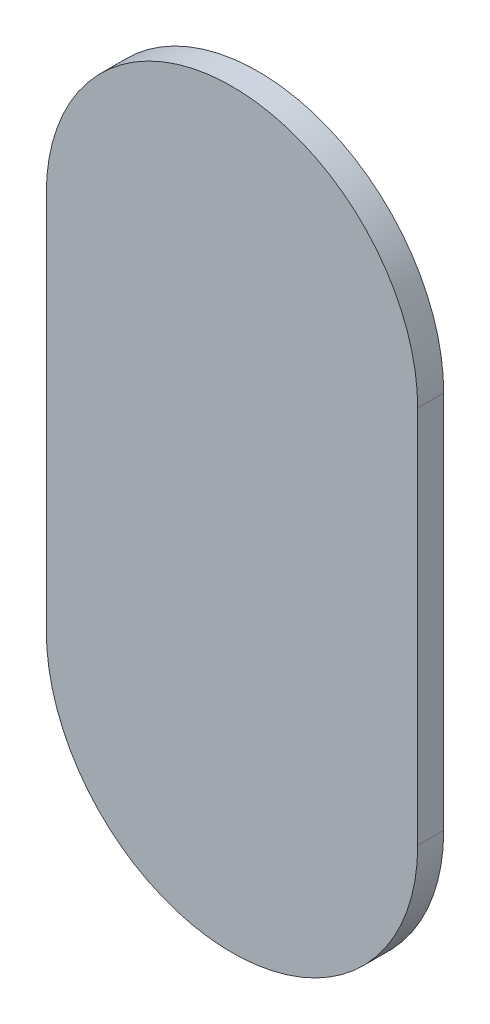
ISO-10303-21;
HEADER;
FILE_DESCRIPTION(('STEP AP214'),'2;1');
FILE_NAME('part.step','',(''),(''),'','','');
FILE_SCHEMA(('AUTOMOTIVE_DESIGN { 1 0 10303 214 1 1 1 1 }'));
ENDSEC;
DATA;
#1=APPLICATION_CONTEXT('core data for automotive mechanical design processes');
#2=APPLICATION_PROTOCOL_DEFINITION('international standard','automotive_design',2000,#1);
#3=PRODUCT_CONTEXT('',#1,'mechanical');
#4=PRODUCT('Part','Part','',(#3));
#5=PRODUCT_RELATED_PRODUCT_CATEGORY('part','',(#4));
#6=PRODUCT_DEFINITION_FORMATION('','',#4);
#7=PRODUCT_DEFINITION_CONTEXT('part definition',#1,'design');
#8=PRODUCT_DEFINITION('design','',#6,#7);
#9=PRODUCT_DEFINITION_SHAPE('','',#8);
#10=(LENGTH_UNIT() NAMED_UNIT(*) SI_UNIT(.MILLI.,.METRE.));
#11=(NAMED_UNIT(*) PLANE_ANGLE_UNIT() SI_UNIT($,.RADIAN.));
#12=(NAMED_UNIT(*) SI_UNIT($,.STERADIAN.) SOLID_ANGLE_UNIT());
#13=UNCERTAINTY_MEASURE_WITH_UNIT(LENGTH_MEASURE(1.E-05),#10,'distance_accuracy_value','');
#14=(GEOMETRIC_REPRESENTATION_CONTEXT(3) GLOBAL_UNCERTAINTY_ASSIGNED_CONTEXT((#13)) GLOBAL_UNIT_ASSIGNED_CONTEXT((#10,
#11,#12)) REPRESENTATION_CONTEXT('',''));
#15=CARTESIAN_POINT('',(0.,0.,0.));
#16=DIRECTION('',(0.,0.,1.));
#17=DIRECTION('',(1.,0.,0.));
#18=AXIS2_PLACEMENT_3D('',#15,#16,#17);
#19=CARTESIAN_POINT('',(124.5,-59.24,1.635));
#20=DIRECTION('',(0.,0.,1.));
#21=DIRECTION('',(1.,0.,0.));
#22=AXIS2_PLACEMENT_3D('',#19,#20,#21);
#23=PLANE('',#22);
#24=DIRECTION('',(0.,-1.,0.));
#25=VECTOR('',#24,1.);
#26=CARTESIAN_POINT('',(124.5,-59.24,1.635));
#27=LINE('',#26,#25);
#28=CARTESIAN_POINT('',(124.5,-59.24,1.635));
#29=VERTEX_POINT('',#28);
#30=CARTESIAN_POINT('',(124.5,-59.75,1.635));
#31=VERTEX_POINT('',#30);
#32=EDGE_CURVE('E91',#29,#31,#27,.T.);
#33=ORIENTED_EDGE('',*,*,#32,.T.);
#34=CARTESIAN_POINT('',(124.75,-59.75,1.635));
#35=DIRECTION('',(0.,0.,1.));
#36=DIRECTION('',(-1.,0.,0.));
#37=AXIS2_PLACEMENT_3D('',#34,#35,#36);
#38=CIRCLE('',#37,0.25);
#39=CARTESIAN_POINT('',(125.,-59.75,1.635));
#40=VERTEX_POINT('',#39);
#41=EDGE_CURVE('E86',#31,#40,#38,.T.);
#42=ORIENTED_EDGE('',*,*,#41,.T.);
#43=DIRECTION('',(0.,1.,0.));
#44=VECTOR('',#43,1.);
#45=CARTESIAN_POINT('',(125.,-59.75,1.635));
#46=LINE('',#45,#44);
#47=CARTESIAN_POINT('',(125.,-59.24,1.635));
#48=VERTEX_POINT('',#47);
#49=EDGE_CURVE('E101',#40,#48,#46,.T.);
#50=ORIENTED_EDGE('',*,*,#49,.T.);
#51=CARTESIAN_POINT('',(124.75,-59.24,1.635));
#52=DIRECTION('',(0.,0.,1.));
#53=DIRECTION('',(1.,0.,0.));
#54=AXIS2_PLACEMENT_3D('',#51,#52,#53);
#55=CIRCLE('',#54,0.25);
#56=EDGE_CURVE('E11',#48,#29,#55,.T.);
#57=ORIENTED_EDGE('',*,*,#56,.T.);
#58=EDGE_LOOP('',(#33,#42,#50,#57));
#59=FACE_BOUND('',#58,.T.);
#60=ADVANCED_FACE('F17',(#59),#23,.T.);
#61=CARTESIAN_POINT('',(124.5,-59.24,1.6));
#62=DIRECTION('',(0.,0.,1.));
#63=DIRECTION('',(1.,0.,0.));
#64=AXIS2_PLACEMENT_3D('',#61,#62,#63);
#65=PLANE('',#64);
#66=CARTESIAN_POINT('',(124.75,-59.24,1.6));
#67=DIRECTION('',(0.,0.,1.));
#68=DIRECTION('',(1.,0.,0.));
#69=AXIS2_PLACEMENT_3D('',#66,#67,#68);
#70=CIRCLE('',#69,0.25);
#71=CARTESIAN_POINT('',(125.,-59.24,1.6));
#72=VERTEX_POINT('',#71);
#73=CARTESIAN_POINT('',(124.5,-59.24,1.6));
#74=VERTEX_POINT('',#73);
#75=EDGE_CURVE('E20',#72,#74,#70,.T.);
#76=ORIENTED_EDGE('',*,*,#75,.F.);
#77=DIRECTION('',(0.,1.,0.));
#78=VECTOR('',#77,1.);
#79=CARTESIAN_POINT('',(125.,-59.75,1.6));
#80=LINE('',#79,#78);
#81=CARTESIAN_POINT('',(125.,-59.75,1.6));
#82=VERTEX_POINT('',#81);
#83=EDGE_CURVE('E74',#82,#72,#80,.T.);
#84=ORIENTED_EDGE('',*,*,#83,.F.);
#85=CARTESIAN_POINT('',(124.75,-59.75,1.6));
#86=DIRECTION('',(0.,0.,1.));
#87=DIRECTION('',(-1.,0.,0.));
#88=AXIS2_PLACEMENT_3D('',#85,#86,#87);
#89=CIRCLE('',#88,0.25);
#90=CARTESIAN_POINT('',(124.5,-59.75,1.6));
#91=VERTEX_POINT('',#90);
#92=EDGE_CURVE('E68',#91,#82,#89,.T.);
#93=ORIENTED_EDGE('',*,*,#92,.F.);
#94=DIRECTION('',(0.,-1.,0.));
#95=VECTOR('',#94,1.);
#96=CARTESIAN_POINT('',(124.5,-59.24,1.6));
#97=LINE('',#96,#95);
#98=EDGE_CURVE('E72',#74,#91,#97,.T.);
#99=ORIENTED_EDGE('',*,*,#98,.F.);
#100=EDGE_LOOP('',(#76,#84,#93,#99));
#101=FACE_BOUND('',#100,.T.);
#102=ADVANCED_FACE('F70',(#101),#65,.F.);
#103=CARTESIAN_POINT('',(124.75,-59.24,1.6));
#104=DIRECTION('',(0.,0.,-1.));
#105=DIRECTION('',(1.,0.,0.));
#106=AXIS2_PLACEMENT_3D('',#103,#104,#105);
#107=CYLINDRICAL_SURFACE('',#106,0.25);
#108=ORIENTED_EDGE('',*,*,#75,.T.);
#109=DIRECTION('',(0.,0.,1.));
#110=VECTOR('',#109,1.);
#111=CARTESIAN_POINT('',(124.5,-59.24,1.6));
#112=LINE('',#111,#110);
#113=EDGE_CURVE('E80',#74,#29,#112,.T.);
#114=ORIENTED_EDGE('',*,*,#113,.T.);
#115=ORIENTED_EDGE('',*,*,#56,.F.);
#116=DIRECTION('',(0.,0.,1.));
#117=VECTOR('',#116,1.);
#118=CARTESIAN_POINT('',(125.,-59.24,1.6));
#119=LINE('',#118,#117);
#120=EDGE_CURVE('E109',#72,#48,#119,.T.);
#121=ORIENTED_EDGE('',*,*,#120,.F.);
#122=EDGE_LOOP('',(#108,#114,#115,#121));
#123=FACE_BOUND('',#122,.T.);
#124=ADVANCED_FACE('F121',(#123),#107,.T.);
#125=CARTESIAN_POINT('',(125.,-59.75,1.6));
#126=DIRECTION('',(-1.,0.,0.));
#127=DIRECTION('',(0.,0.,1.));
#128=AXIS2_PLACEMENT_3D('',#125,#126,#127);
#129=PLANE('',#128);
#130=ORIENTED_EDGE('',*,*,#83,.T.);
#131=ORIENTED_EDGE('',*,*,#120,.T.);
#132=ORIENTED_EDGE('',*,*,#49,.F.);
#133=DIRECTION('',(0.,0.,1.));
#134=VECTOR('',#133,1.);
#135=CARTESIAN_POINT('',(125.,-59.75,1.6));
#136=LINE('',#135,#134);
#137=EDGE_CURVE('E79',#82,#40,#136,.T.);
#138=ORIENTED_EDGE('',*,*,#137,.F.);
#139=EDGE_LOOP('',(#130,#131,#132,#138));
#140=FACE_BOUND('',#139,.T.);
#141=ADVANCED_FACE('F118',(#140),#129,.F.);
#142=CARTESIAN_POINT('',(124.75,-59.75,1.6));
#143=DIRECTION('',(0.,0.,-1.));
#144=DIRECTION('',(-1.,0.,0.));
#145=AXIS2_PLACEMENT_3D('',#142,#143,#144);
#146=CYLINDRICAL_SURFACE('',#145,0.25);
#147=ORIENTED_EDGE('',*,*,#92,.T.);
#148=ORIENTED_EDGE('',*,*,#137,.T.);
#149=ORIENTED_EDGE('',*,*,#41,.F.);
#150=DIRECTION('',(0.,0.,1.));
#151=VECTOR('',#150,1.);
#152=CARTESIAN_POINT('',(124.5,-59.75,1.6));
#153=LINE('',#152,#151);
#154=EDGE_CURVE('E83',#91,#31,#153,.T.);
#155=ORIENTED_EDGE('',*,*,#154,.F.);
#156=EDGE_LOOP('',(#147,#148,#149,#155));
#157=FACE_BOUND('',#156,.T.);
#158=ADVANCED_FACE('F84',(#157),#146,.T.);
#159=CARTESIAN_POINT('',(124.5,-59.24,1.6));
#160=DIRECTION('',(1.,0.,0.));
#161=DIRECTION('',(0.,1.,0.));
#162=AXIS2_PLACEMENT_3D('',#159,#160,#161);
#163=PLANE('',#162);
#164=ORIENTED_EDGE('',*,*,#98,.T.);
#165=ORIENTED_EDGE('',*,*,#154,.T.);
#166=ORIENTED_EDGE('',*,*,#32,.F.);
#167=ORIENTED_EDGE('',*,*,#113,.F.);
#168=EDGE_LOOP('',(#164,#165,#166,#167));
#169=FACE_BOUND('',#168,.T.);
#170=ADVANCED_FACE('F94',(#169),#163,.F.);
#171=CLOSED_SHELL('',(#60,#102,#124,#141,#158,#170));
#172=MANIFOLD_SOLID_BREP('B1',#171);
#173=ADVANCED_BREP_SHAPE_REPRESENTATION('',(#18,#172),#14);
#174=SHAPE_DEFINITION_REPRESENTATION(#9,#173);
ENDSEC;
END-ISO-10303-21;
